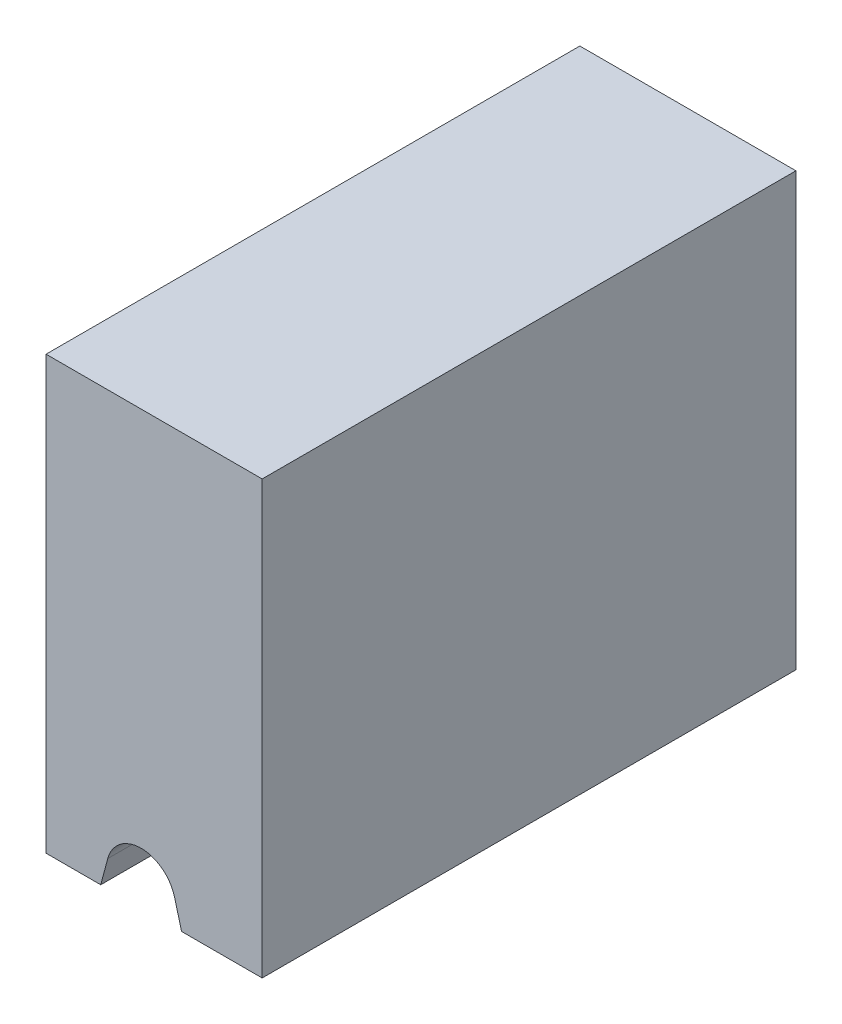
ISO-10303-21;
HEADER;
FILE_DESCRIPTION(('STEP AP214'),'2;1');
FILE_NAME('part.step','',(''),(''),'','','');
FILE_SCHEMA(('AUTOMOTIVE_DESIGN { 1 0 10303 214 1 1 1 1 }'));
ENDSEC;
DATA;
#1=APPLICATION_CONTEXT('core data for automotive mechanical design processes');
#2=APPLICATION_PROTOCOL_DEFINITION('international standard','automotive_design',2000,#1);
#3=PRODUCT_CONTEXT('',#1,'mechanical');
#4=PRODUCT('Part','Part','',(#3));
#5=PRODUCT_RELATED_PRODUCT_CATEGORY('part','',(#4));
#6=PRODUCT_DEFINITION_FORMATION('','',#4);
#7=PRODUCT_DEFINITION_CONTEXT('part definition',#1,'design');
#8=PRODUCT_DEFINITION('design','',#6,#7);
#9=PRODUCT_DEFINITION_SHAPE('','',#8);
#10=(LENGTH_UNIT() NAMED_UNIT(*) SI_UNIT(.MILLI.,.METRE.));
#11=(NAMED_UNIT(*) PLANE_ANGLE_UNIT() SI_UNIT($,.RADIAN.));
#12=(NAMED_UNIT(*) SI_UNIT($,.STERADIAN.) SOLID_ANGLE_UNIT());
#13=UNCERTAINTY_MEASURE_WITH_UNIT(LENGTH_MEASURE(1.E-05),#10,'distance_accuracy_value','');
#14=(GEOMETRIC_REPRESENTATION_CONTEXT(3) GLOBAL_UNCERTAINTY_ASSIGNED_CONTEXT((#13)) GLOBAL_UNIT_ASSIGNED_CONTEXT((#10,
#11,#12)) REPRESENTATION_CONTEXT('',''));
#15=CARTESIAN_POINT('',(0.,0.,0.));
#16=DIRECTION('',(0.,0.,1.));
#17=DIRECTION('',(1.,0.,0.));
#18=AXIS2_PLACEMENT_3D('',#15,#16,#17);
#19=CARTESIAN_POINT('',(-12.5,-50.,30.875));
#20=DIRECTION('',(0.,1.,0.));
#21=DIRECTION('',(-1.,0.,0.));
#22=AXIS2_PLACEMENT_3D('',#19,#20,#21);
#23=PLANE('',#22);
#24=DIRECTION('',(1.,0.,0.));
#25=VECTOR('',#24,1.);
#26=CARTESIAN_POINT('',(-12.5,-50.,-30.875));
#27=LINE('',#26,#25);
#28=CARTESIAN_POINT('',(-12.5,-50.,-30.875));
#29=VERTEX_POINT('',#28);
#30=CARTESIAN_POINT('',(-6.17700310650259,-50.,-30.875));
#31=VERTEX_POINT('',#30);
#32=EDGE_CURVE('E156',#29,#31,#27,.T.);
#33=ORIENTED_EDGE('',*,*,#32,.T.);
#34=DIRECTION('',(0.,0.,-1.));
#35=VECTOR('',#34,1.);
#36=CARTESIAN_POINT('',(-6.17700310650259,-50.,30.876));
#37=LINE('',#36,#35);
#38=CARTESIAN_POINT('',(-6.17700310650259,-50.,30.875));
#39=VERTEX_POINT('',#38);
#40=EDGE_CURVE('E142',#39,#31,#37,.T.);
#41=ORIENTED_EDGE('',*,*,#40,.F.);
#42=DIRECTION('',(1.,0.,0.));
#43=VECTOR('',#42,1.);
#44=CARTESIAN_POINT('',(-12.5,-50.,30.875));
#45=LINE('',#44,#43);
#46=CARTESIAN_POINT('',(-12.5,-50.,30.875));
#47=VERTEX_POINT('',#46);
#48=EDGE_CURVE('E91',#47,#39,#45,.T.);
#49=ORIENTED_EDGE('',*,*,#48,.F.);
#50=DIRECTION('',(0.,0.,-1.));
#51=VECTOR('',#50,1.);
#52=CARTESIAN_POINT('',(-12.5,-50.,30.875));
#53=LINE('',#52,#51);
#54=EDGE_CURVE('E11',#47,#29,#53,.T.);
#55=ORIENTED_EDGE('',*,*,#54,.T.);
#56=EDGE_LOOP('',(#33,#41,#49,#55));
#57=FACE_BOUND('',#56,.T.);
#58=ADVANCED_FACE('F39',(#57),#23,.F.);
#59=CARTESIAN_POINT('',(-12.5,-50.,30.875));
#60=DIRECTION('',(1.,0.,0.));
#61=DIRECTION('',(0.,1.,0.));
#62=AXIS2_PLACEMENT_3D('',#59,#60,#61);
#63=PLANE('',#62);
#64=DIRECTION('',(0.,-1.,0.));
#65=VECTOR('',#64,1.);
#66=CARTESIAN_POINT('',(-12.5,-50.,-30.875));
#67=LINE('',#66,#65);
#68=CARTESIAN_POINT('',(-12.5,0.,-30.875));
#69=VERTEX_POINT('',#68);
#70=EDGE_CURVE('E128',#69,#29,#67,.T.);
#71=ORIENTED_EDGE('',*,*,#70,.T.);
#72=ORIENTED_EDGE('',*,*,#54,.F.);
#73=DIRECTION('',(0.,-1.,0.));
#74=VECTOR('',#73,1.);
#75=CARTESIAN_POINT('',(-12.5,-50.,30.875));
#76=LINE('',#75,#74);
#77=CARTESIAN_POINT('',(-12.5,0.,30.875));
#78=VERTEX_POINT('',#77);
#79=EDGE_CURVE('E145',#78,#47,#76,.T.);
#80=ORIENTED_EDGE('',*,*,#79,.F.);
#81=DIRECTION('',(0.,0.,-1.));
#82=VECTOR('',#81,1.);
#83=CARTESIAN_POINT('',(-12.5,0.,30.875));
#84=LINE('',#83,#82);
#85=EDGE_CURVE('E152',#78,#69,#84,.T.);
#86=ORIENTED_EDGE('',*,*,#85,.T.);
#87=EDGE_LOOP('',(#71,#72,#80,#86));
#88=FACE_BOUND('',#87,.T.);
#89=ADVANCED_FACE('F41',(#88),#63,.F.);
#90=CARTESIAN_POINT('',(3.17700310650258,-50.,30.875));
#91=VERTEX_POINT('',#90);
#92=CARTESIAN_POINT('',(12.5,-50.,30.875));
#93=VERTEX_POINT('',#92);
#94=EDGE_CURVE('E147',#91,#93,#45,.T.);
#95=ORIENTED_EDGE('',*,*,#94,.F.);
#96=DIRECTION('',(0.,0.,-1.));
#97=VECTOR('',#96,1.);
#98=CARTESIAN_POINT('',(3.17700310650258,-50.,30.876));
#99=LINE('',#98,#97);
#100=CARTESIAN_POINT('',(3.17700310650258,-50.,-30.875));
#101=VERTEX_POINT('',#100);
#102=EDGE_CURVE('E120',#91,#101,#99,.T.);
#103=ORIENTED_EDGE('',*,*,#102,.T.);
#104=CARTESIAN_POINT('',(12.5,-50.,-30.875));
#105=VERTEX_POINT('',#104);
#106=EDGE_CURVE('E155',#101,#105,#27,.T.);
#107=ORIENTED_EDGE('',*,*,#106,.T.);
#108=DIRECTION('',(0.,0.,-1.));
#109=VECTOR('',#108,1.);
#110=CARTESIAN_POINT('',(12.5,-50.,30.875));
#111=LINE('',#110,#109);
#112=EDGE_CURVE('E47',#93,#105,#111,.T.);
#113=ORIENTED_EDGE('',*,*,#112,.F.);
#114=EDGE_LOOP('',(#95,#103,#107,#113));
#115=FACE_BOUND('',#114,.T.);
#116=ADVANCED_FACE('F189',(#115),#23,.F.);
#117=CARTESIAN_POINT('',(12.5,-50.,30.875));
#118=DIRECTION('',(-1.,0.,0.));
#119=DIRECTION('',(0.,-1.,0.));
#120=AXIS2_PLACEMENT_3D('',#117,#118,#119);
#121=PLANE('',#120);
#122=DIRECTION('',(0.,1.,0.));
#123=VECTOR('',#122,1.);
#124=CARTESIAN_POINT('',(12.5,-50.,-30.875));
#125=LINE('',#124,#123);
#126=CARTESIAN_POINT('',(12.5,0.,-30.875));
#127=VERTEX_POINT('',#126);
#128=EDGE_CURVE('E159',#105,#127,#125,.T.);
#129=ORIENTED_EDGE('',*,*,#128,.T.);
#130=DIRECTION('',(0.,0.,-1.));
#131=VECTOR('',#130,1.);
#132=CARTESIAN_POINT('',(12.5,0.,30.875));
#133=LINE('',#132,#131);
#134=CARTESIAN_POINT('',(12.5,0.,30.875));
#135=VERTEX_POINT('',#134);
#136=EDGE_CURVE('E163',#135,#127,#133,.T.);
#137=ORIENTED_EDGE('',*,*,#136,.F.);
#138=DIRECTION('',(0.,1.,0.));
#139=VECTOR('',#138,1.);
#140=CARTESIAN_POINT('',(12.5,-50.,30.875));
#141=LINE('',#140,#139);
#142=EDGE_CURVE('E149',#93,#135,#141,.T.);
#143=ORIENTED_EDGE('',*,*,#142,.F.);
#144=ORIENTED_EDGE('',*,*,#112,.T.);
#145=EDGE_LOOP('',(#129,#137,#143,#144));
#146=FACE_BOUND('',#145,.T.);
#147=ADVANCED_FACE('F169',(#146),#121,.F.);
#148=CARTESIAN_POINT('',(-12.5,0.,30.875));
#149=DIRECTION('',(0.,-1.,0.));
#150=DIRECTION('',(1.,0.,0.));
#151=AXIS2_PLACEMENT_3D('',#148,#149,#150);
#152=PLANE('',#151);
#153=DIRECTION('',(-1.,0.,0.));
#154=VECTOR('',#153,1.);
#155=CARTESIAN_POINT('',(-12.5,0.,-30.875));
#156=LINE('',#155,#154);
#157=EDGE_CURVE('E84',#127,#69,#156,.T.);
#158=ORIENTED_EDGE('',*,*,#157,.T.);
#159=ORIENTED_EDGE('',*,*,#85,.F.);
#160=DIRECTION('',(-1.,0.,0.));
#161=VECTOR('',#160,1.);
#162=CARTESIAN_POINT('',(-12.5,0.,30.875));
#163=LINE('',#162,#161);
#164=EDGE_CURVE('E63',#135,#78,#163,.T.);
#165=ORIENTED_EDGE('',*,*,#164,.F.);
#166=ORIENTED_EDGE('',*,*,#136,.T.);
#167=EDGE_LOOP('',(#158,#159,#165,#166));
#168=FACE_BOUND('',#167,.T.);
#169=ADVANCED_FACE('F180',(#168),#152,.F.);
#170=CARTESIAN_POINT('',(0.,0.,30.875));
#171=DIRECTION('',(0.,0.,-1.));
#172=DIRECTION('',(-1.,0.,0.));
#173=AXIS2_PLACEMENT_3D('',#170,#171,#172);
#174=PLANE('',#173);
#175=ORIENTED_EDGE('',*,*,#48,.T.);
#176=DIRECTION('',(-0.258819045102522,-0.965925826289068,0.));
#177=VECTOR('',#176,1.);
#178=CARTESIAN_POINT('',(-5.36370330515628,-46.9647238195899,30.875));
#179=LINE('',#178,#177);
#180=CARTESIAN_POINT('',(-5.36370330515628,-46.9647238195899,30.875));
#181=VERTEX_POINT('',#180);
#182=EDGE_CURVE('E132',#181,#39,#179,.T.);
#183=ORIENTED_EDGE('',*,*,#182,.F.);
#184=CARTESIAN_POINT('',(-1.50000000000001,-48.,30.875));
#185=DIRECTION('',(0.,0.,-1.));
#186=DIRECTION('',(-1.,0.,0.));
#187=AXIS2_PLACEMENT_3D('',#184,#185,#186);
#188=CIRCLE('',#187,4.);
#189=CARTESIAN_POINT('',(2.36370330515627,-46.9647238195899,30.875));
#190=VERTEX_POINT('',#189);
#191=EDGE_CURVE('E116',#190,#181,#188,.F.);
#192=ORIENTED_EDGE('',*,*,#191,.F.);
#193=DIRECTION('',(-0.258819045102521,0.965925826289068,0.));
#194=VECTOR('',#193,1.);
#195=CARTESIAN_POINT('',(2.36370330515627,-46.9647238195899,30.875));
#196=LINE('',#195,#194);
#197=EDGE_CURVE('E124',#91,#190,#196,.T.);
#198=ORIENTED_EDGE('',*,*,#197,.F.);
#199=ORIENTED_EDGE('',*,*,#94,.T.);
#200=ORIENTED_EDGE('',*,*,#142,.T.);
#201=ORIENTED_EDGE('',*,*,#164,.T.);
#202=ORIENTED_EDGE('',*,*,#79,.T.);
#203=EDGE_LOOP('',(#175,#183,#192,#198,#199,#200,#201,#202));
#204=FACE_BOUND('',#203,.T.);
#205=ADVANCED_FACE('F131',(#204),#174,.F.);
#206=CARTESIAN_POINT('',(0.,0.,-30.875));
#207=DIRECTION('',(0.,0.,-1.));
#208=DIRECTION('',(-1.,0.,0.));
#209=AXIS2_PLACEMENT_3D('',#206,#207,#208);
#210=PLANE('',#209);
#211=DIRECTION('',(0.258819045102522,0.965925826289068,0.));
#212=VECTOR('',#211,1.);
#213=CARTESIAN_POINT('',(-5.36370330515628,-46.9647238195899,-30.875));
#214=LINE('',#213,#212);
#215=CARTESIAN_POINT('',(-5.36370330515628,-46.9647238195899,-30.875));
#216=VERTEX_POINT('',#215);
#217=EDGE_CURVE('E121',#31,#216,#214,.T.);
#218=ORIENTED_EDGE('',*,*,#217,.F.);
#219=ORIENTED_EDGE('',*,*,#32,.F.);
#220=ORIENTED_EDGE('',*,*,#70,.F.);
#221=ORIENTED_EDGE('',*,*,#157,.F.);
#222=ORIENTED_EDGE('',*,*,#128,.F.);
#223=ORIENTED_EDGE('',*,*,#106,.F.);
#224=DIRECTION('',(0.258819045102521,-0.965925826289068,0.));
#225=VECTOR('',#224,1.);
#226=CARTESIAN_POINT('',(2.36370330515627,-46.9647238195899,-30.875));
#227=LINE('',#226,#225);
#228=CARTESIAN_POINT('',(2.36370330515627,-46.9647238195899,-30.875));
#229=VERTEX_POINT('',#228);
#230=EDGE_CURVE('E137',#229,#101,#227,.T.);
#231=ORIENTED_EDGE('',*,*,#230,.F.);
#232=CARTESIAN_POINT('',(-1.50000000000001,-48.,-30.875));
#233=DIRECTION('',(0.,0.,-1.));
#234=DIRECTION('',(-1.,0.,0.));
#235=AXIS2_PLACEMENT_3D('',#232,#233,#234);
#236=CIRCLE('',#235,4.);
#237=EDGE_CURVE('E54',#216,#229,#236,.T.);
#238=ORIENTED_EDGE('',*,*,#237,.F.);
#239=EDGE_LOOP('',(#218,#219,#220,#221,#222,#223,#231,#238));
#240=FACE_BOUND('',#239,.T.);
#241=ADVANCED_FACE('F175',(#240),#210,.T.);
#242=CARTESIAN_POINT('',(-1.50000000000001,-48.,30.876));
#243=DIRECTION('',(0.,0.,-1.));
#244=DIRECTION('',(-1.,0.,0.));
#245=AXIS2_PLACEMENT_3D('',#242,#243,#244);
#246=CYLINDRICAL_SURFACE('',#245,4.);
#247=ORIENTED_EDGE('',*,*,#191,.T.);
#248=DIRECTION('',(0.,0.,-1.));
#249=VECTOR('',#248,1.);
#250=CARTESIAN_POINT('',(-5.36370330515628,-46.9647238195899,30.876));
#251=LINE('',#250,#249);
#252=EDGE_CURVE('E129',#181,#216,#251,.T.);
#253=ORIENTED_EDGE('',*,*,#252,.T.);
#254=ORIENTED_EDGE('',*,*,#237,.T.);
#255=DIRECTION('',(0.,0.,-1.));
#256=VECTOR('',#255,1.);
#257=CARTESIAN_POINT('',(2.36370330515627,-46.9647238195899,30.876));
#258=LINE('',#257,#256);
#259=EDGE_CURVE('E112',#190,#229,#258,.T.);
#260=ORIENTED_EDGE('',*,*,#259,.F.);
#261=EDGE_LOOP('',(#247,#253,#254,#260));
#262=FACE_BOUND('',#261,.T.);
#263=ADVANCED_FACE('F114',(#262),#246,.F.);
#264=CARTESIAN_POINT('',(-5.36370330515628,-46.9647238195899,30.876));
#265=DIRECTION('',(-0.965925826289068,0.258819045102522,0.));
#266=DIRECTION('',(-0.258819045102522,-0.965925826289068,0.));
#267=AXIS2_PLACEMENT_3D('',#264,#265,#266);
#268=PLANE('',#267);
#269=ORIENTED_EDGE('',*,*,#182,.T.);
#270=ORIENTED_EDGE('',*,*,#40,.T.);
#271=ORIENTED_EDGE('',*,*,#217,.T.);
#272=ORIENTED_EDGE('',*,*,#252,.F.);
#273=EDGE_LOOP('',(#269,#270,#271,#272));
#274=FACE_BOUND('',#273,.T.);
#275=ADVANCED_FACE('F219',(#274),#268,.F.);
#276=CARTESIAN_POINT('',(2.36370330515627,-46.9647238195899,30.876));
#277=DIRECTION('',(0.965925826289068,0.258819045102521,0.));
#278=DIRECTION('',(-0.258819045102521,0.965925826289068,0.));
#279=AXIS2_PLACEMENT_3D('',#276,#277,#278);
#280=PLANE('',#279);
#281=ORIENTED_EDGE('',*,*,#197,.T.);
#282=ORIENTED_EDGE('',*,*,#259,.T.);
#283=ORIENTED_EDGE('',*,*,#230,.T.);
#284=ORIENTED_EDGE('',*,*,#102,.F.);
#285=EDGE_LOOP('',(#281,#282,#283,#284));
#286=FACE_BOUND('',#285,.T.);
#287=ADVANCED_FACE('F125',(#286),#280,.F.);
#288=CLOSED_SHELL('',(#58,#89,#116,#147,#169,#205,#241,#263,#275,#287));
#289=MANIFOLD_SOLID_BREP('B2',#288);
#290=ADVANCED_BREP_SHAPE_REPRESENTATION('',(#18,#289),#14);
#291=SHAPE_DEFINITION_REPRESENTATION(#9,#290);
ENDSEC;
END-ISO-10303-21;
